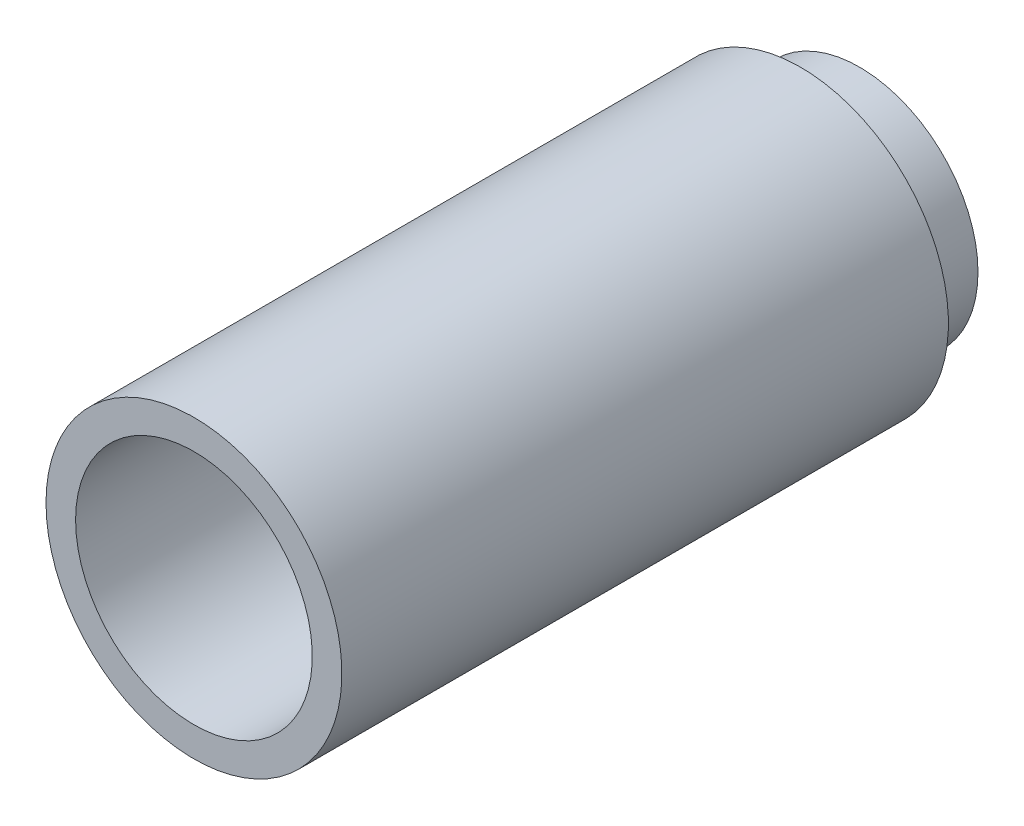
ISO-10303-21;
HEADER;
FILE_DESCRIPTION(('STEP AP214'),'2;1');
FILE_NAME('part.step','',(''),(''),'','','');
FILE_SCHEMA(('AUTOMOTIVE_DESIGN { 1 0 10303 214 1 1 1 1 }'));
ENDSEC;
DATA;
#1=APPLICATION_CONTEXT('core data for automotive mechanical design processes');
#2=APPLICATION_PROTOCOL_DEFINITION('international standard','automotive_design',2000,#1);
#3=PRODUCT_CONTEXT('',#1,'mechanical');
#4=PRODUCT('Part','Part','',(#3));
#5=PRODUCT_RELATED_PRODUCT_CATEGORY('part','',(#4));
#6=PRODUCT_DEFINITION_FORMATION('','',#4);
#7=PRODUCT_DEFINITION_CONTEXT('part definition',#1,'design');
#8=PRODUCT_DEFINITION('design','',#6,#7);
#9=PRODUCT_DEFINITION_SHAPE('','',#8);
#10=(LENGTH_UNIT() NAMED_UNIT(*) SI_UNIT(.MILLI.,.METRE.));
#11=(NAMED_UNIT(*) PLANE_ANGLE_UNIT() SI_UNIT($,.RADIAN.));
#12=(NAMED_UNIT(*) SI_UNIT($,.STERADIAN.) SOLID_ANGLE_UNIT());
#13=UNCERTAINTY_MEASURE_WITH_UNIT(LENGTH_MEASURE(1.E-05),#10,'distance_accuracy_value','');
#14=(GEOMETRIC_REPRESENTATION_CONTEXT(3) GLOBAL_UNCERTAINTY_ASSIGNED_CONTEXT((#13)) GLOBAL_UNIT_ASSIGNED_CONTEXT((#10,
#11,#12)) REPRESENTATION_CONTEXT('',''));
#15=CARTESIAN_POINT('',(0.,0.,0.));
#16=DIRECTION('',(0.,0.,1.));
#17=DIRECTION('',(1.,0.,0.));
#18=AXIS2_PLACEMENT_3D('',#15,#16,#17);
#19=CARTESIAN_POINT('',(0.,0.,225.));
#20=DIRECTION('',(0.,0.,1.));
#21=DIRECTION('',(1.,0.,0.));
#22=AXIS2_PLACEMENT_3D('',#19,#20,#21);
#23=PLANE('',#22);
#24=CARTESIAN_POINT('',(0.,0.,225.));
#25=DIRECTION('',(0.,0.,1.));
#26=DIRECTION('',(1.,0.,0.));
#27=AXIS2_PLACEMENT_3D('',#24,#25,#26);
#28=CIRCLE('',#27,50.);
#29=CARTESIAN_POINT('',(-50.,0.,225.));
#30=VERTEX_POINT('',#29);
#31=EDGE_CURVE('E11',#30,#30,#28,.T.);
#32=ORIENTED_EDGE('',*,*,#31,.T.);
#33=EDGE_LOOP('',(#32));
#34=FACE_BOUND('',#33,.T.);
#35=CARTESIAN_POINT('',(0.,0.,225.));
#36=DIRECTION('',(0.,0.,1.));
#37=DIRECTION('',(1.,0.,0.));
#38=AXIS2_PLACEMENT_3D('',#35,#36,#37);
#39=CIRCLE('',#38,40.);
#40=CARTESIAN_POINT('',(-40.,0.,225.));
#41=VERTEX_POINT('',#40);
#42=EDGE_CURVE('E50',#41,#41,#39,.T.);
#43=ORIENTED_EDGE('',*,*,#42,.F.);
#44=EDGE_LOOP('',(#43));
#45=FACE_BOUND('',#44,.T.);
#46=ADVANCED_FACE('F39',(#34,#45),#23,.T.);
#47=CARTESIAN_POINT('',(0.,0.,20.));
#48=DIRECTION('',(0.,0.,1.));
#49=DIRECTION('',(1.,0.,0.));
#50=AXIS2_PLACEMENT_3D('',#47,#48,#49);
#51=PLANE('',#50);
#52=CARTESIAN_POINT('',(0.,0.,20.));
#53=DIRECTION('',(0.,0.,1.));
#54=DIRECTION('',(1.,0.,0.));
#55=AXIS2_PLACEMENT_3D('',#52,#53,#54);
#56=CIRCLE('',#55,50.);
#57=CARTESIAN_POINT('',(-50.,0.,20.));
#58=VERTEX_POINT('',#57);
#59=EDGE_CURVE('E43',#58,#58,#56,.T.);
#60=ORIENTED_EDGE('',*,*,#59,.F.);
#61=EDGE_LOOP('',(#60));
#62=FACE_BOUND('',#61,.T.);
#63=CARTESIAN_POINT('',(0.,0.,20.));
#64=DIRECTION('',(0.,0.,1.));
#65=DIRECTION('',(1.,0.,0.));
#66=AXIS2_PLACEMENT_3D('',#63,#64,#65);
#67=CIRCLE('',#66,40.);
#68=CARTESIAN_POINT('',(-40.,0.,20.));
#69=VERTEX_POINT('',#68);
#70=EDGE_CURVE('E52',#69,#69,#67,.T.);
#71=ORIENTED_EDGE('',*,*,#70,.T.);
#72=EDGE_LOOP('',(#71));
#73=FACE_BOUND('',#72,.T.);
#74=ADVANCED_FACE('F62',(#62,#73),#51,.F.);
#75=CARTESIAN_POINT('',(0.,0.,225.));
#76=DIRECTION('',(0.,0.,-1.));
#77=DIRECTION('',(-1.,0.,0.));
#78=AXIS2_PLACEMENT_3D('',#75,#76,#77);
#79=CYLINDRICAL_SURFACE('',#78,50.);
#80=CARTESIAN_POINT('',(-50.,0.,225.));
#81=CARTESIAN_POINT('',(-50.,0.,222.864583333333));
#82=CARTESIAN_POINT('',(-50.,0.,220.729166666667));
#83=CARTESIAN_POINT('',(-50.,0.,216.458333333333));
#84=CARTESIAN_POINT('',(-50.,0.,214.322916666667));
#85=CARTESIAN_POINT('',(-50.,0.,210.052083333333));
#86=CARTESIAN_POINT('',(-50.,0.,207.916666666667));
#87=CARTESIAN_POINT('',(-50.,0.,203.645833333333));
#88=CARTESIAN_POINT('',(-50.,0.,201.510416666667));
#89=CARTESIAN_POINT('',(-50.,0.,197.239583333333));
#90=CARTESIAN_POINT('',(-50.,0.,195.104166666667));
#91=CARTESIAN_POINT('',(-50.,0.,190.833333333333));
#92=CARTESIAN_POINT('',(-50.,0.,188.697916666667));
#93=CARTESIAN_POINT('',(-50.,0.,184.427083333333));
#94=CARTESIAN_POINT('',(-50.,0.,182.291666666667));
#95=CARTESIAN_POINT('',(-50.,0.,178.020833333333));
#96=CARTESIAN_POINT('',(-50.,0.,175.885416666667));
#97=CARTESIAN_POINT('',(-50.,0.,171.614583333333));
#98=CARTESIAN_POINT('',(-50.,0.,169.479166666667));
#99=CARTESIAN_POINT('',(-50.,0.,165.208333333333));
#100=CARTESIAN_POINT('',(-50.,0.,163.072916666667));
#101=CARTESIAN_POINT('',(-50.,0.,158.802083333333));
#102=CARTESIAN_POINT('',(-50.,0.,156.666666666667));
#103=CARTESIAN_POINT('',(-50.,0.,152.395833333333));
#104=CARTESIAN_POINT('',(-50.,0.,150.260416666667));
#105=CARTESIAN_POINT('',(-50.,0.,145.989583333333));
#106=CARTESIAN_POINT('',(-50.,0.,143.854166666667));
#107=CARTESIAN_POINT('',(-50.,0.,139.583333333333));
#108=CARTESIAN_POINT('',(-50.,0.,137.447916666667));
#109=CARTESIAN_POINT('',(-50.,0.,133.177083333333));
#110=CARTESIAN_POINT('',(-50.,0.,131.041666666667));
#111=CARTESIAN_POINT('',(-50.,0.,126.770833333333));
#112=CARTESIAN_POINT('',(-50.,0.,124.635416666667));
#113=CARTESIAN_POINT('',(-50.,0.,120.364583333333));
#114=CARTESIAN_POINT('',(-50.,0.,118.229166666667));
#115=CARTESIAN_POINT('',(-50.,0.,113.958333333333));
#116=CARTESIAN_POINT('',(-50.,0.,111.822916666667));
#117=CARTESIAN_POINT('',(-50.,0.,107.552083333333));
#118=CARTESIAN_POINT('',(-50.,0.,105.416666666667));
#119=CARTESIAN_POINT('',(-50.,0.,101.145833333333));
#120=CARTESIAN_POINT('',(-50.,0.,99.0104166666667));
#121=CARTESIAN_POINT('',(-50.,0.,94.7395833333333));
#122=CARTESIAN_POINT('',(-50.,0.,92.6041666666667));
#123=CARTESIAN_POINT('',(-50.,0.,88.3333333333333));
#124=CARTESIAN_POINT('',(-50.,0.,86.1979166666667));
#125=CARTESIAN_POINT('',(-50.,0.,81.9270833333333));
#126=CARTESIAN_POINT('',(-50.,0.,79.7916666666666));
#127=CARTESIAN_POINT('',(-50.,0.,75.5208333333333));
#128=CARTESIAN_POINT('',(-50.,0.,73.3854166666666));
#129=CARTESIAN_POINT('',(-50.,0.,69.1145833333333));
#130=CARTESIAN_POINT('',(-50.,0.,66.9791666666666));
#131=CARTESIAN_POINT('',(-50.,0.,62.7083333333333));
#132=CARTESIAN_POINT('',(-50.,0.,60.5729166666666));
#133=CARTESIAN_POINT('',(-50.,0.,56.3020833333333));
#134=CARTESIAN_POINT('',(-50.,0.,54.1666666666667));
#135=CARTESIAN_POINT('',(-50.,0.,49.8958333333333));
#136=CARTESIAN_POINT('',(-50.,0.,47.7604166666667));
#137=CARTESIAN_POINT('',(-50.,0.,43.4895833333333));
#138=CARTESIAN_POINT('',(-50.,0.,41.3541666666667));
#139=CARTESIAN_POINT('',(-50.,0.,37.0833333333333));
#140=CARTESIAN_POINT('',(-50.,0.,34.9479166666667));
#141=CARTESIAN_POINT('',(-50.,0.,30.6770833333333));
#142=CARTESIAN_POINT('',(-50.,0.,28.5416666666667));
#143=CARTESIAN_POINT('',(-50.,0.,24.2708333333333));
#144=CARTESIAN_POINT('',(-50.,0.,22.1354166666667));
#145=CARTESIAN_POINT('',(-50.,0.,20.));
#146=B_SPLINE_CURVE_WITH_KNOTS('',3,(#80,#81,#82,#83,#84,#85,#86,#87,#88,#89,#90,#91,#92,#93,
#94,#95,#96,#97,#98,#99,#100,#101,#102,#103,#104,#105,#106,#107,#108,#109,#110,#111,#112,#113,
#114,#115,#116,#117,#118,#119,#120,#121,#122,#123,#124,#125,#126,#127,#128,#129,#130,#131,#132,
#133,#134,#135,#136,#137,#138,#139,#140,#141,#142,#143,#144,#145),.UNSPECIFIED.,.F.,.F.,(4,2,2,
2,2,2,2,2,2,2,2,2,2,2,2,2,2,2,2,2,2,2,2,2,2,2,2,2,2,2,2,2,4),(0.,6.40624999999997,12.8125,
19.21875,25.625,32.03125,38.4375,44.84375,51.25,57.65625,64.0625,70.46875,76.875,83.28125,
89.6874999999999,96.0937499999999,102.5,108.90625,115.3125,121.71875,128.125,134.53125,140.9375,
147.34375,153.75,160.15625,166.5625,172.96875,179.375,185.78125,192.1875,198.59375,205.),.UNSPECIFIED.);
#147=EDGE_CURVE('BSEAM41',#30,#58,#146,.T.);
#148=ORIENTED_EDGE('',*,*,#31,.F.);
#149=ORIENTED_EDGE('',*,*,#59,.T.);
#150=ORIENTED_EDGE('',*,*,#147,.T.);
#151=ORIENTED_EDGE('',*,*,#147,.F.);
#152=EDGE_LOOP('',(#148,#150,#149,#151));
#153=FACE_BOUND('',#152,.T.);
#154=ADVANCED_FACE('F41',(#153),#79,.T.);
#155=CARTESIAN_POINT('',(0.,0.,225.));
#156=DIRECTION('',(0.,0.,-1.));
#157=DIRECTION('',(-1.,0.,0.));
#158=AXIS2_PLACEMENT_3D('',#155,#156,#157);
#159=CYLINDRICAL_SURFACE('',#158,40.);
#160=CARTESIAN_POINT('',(-40.,0.,225.));
#161=CARTESIAN_POINT('',(-40.,0.,222.864583333333));
#162=CARTESIAN_POINT('',(-40.,0.,220.729166666667));
#163=CARTESIAN_POINT('',(-40.,0.,216.458333333333));
#164=CARTESIAN_POINT('',(-40.,0.,214.322916666667));
#165=CARTESIAN_POINT('',(-40.,0.,210.052083333333));
#166=CARTESIAN_POINT('',(-40.,0.,207.916666666667));
#167=CARTESIAN_POINT('',(-40.,0.,203.645833333333));
#168=CARTESIAN_POINT('',(-40.,0.,201.510416666667));
#169=CARTESIAN_POINT('',(-40.,0.,197.239583333333));
#170=CARTESIAN_POINT('',(-40.,0.,195.104166666667));
#171=CARTESIAN_POINT('',(-40.,0.,190.833333333333));
#172=CARTESIAN_POINT('',(-40.,0.,188.697916666667));
#173=CARTESIAN_POINT('',(-40.,0.,184.427083333333));
#174=CARTESIAN_POINT('',(-40.,0.,182.291666666667));
#175=CARTESIAN_POINT('',(-40.,0.,178.020833333333));
#176=CARTESIAN_POINT('',(-40.,0.,175.885416666667));
#177=CARTESIAN_POINT('',(-40.,0.,171.614583333333));
#178=CARTESIAN_POINT('',(-40.,0.,169.479166666667));
#179=CARTESIAN_POINT('',(-40.,0.,165.208333333333));
#180=CARTESIAN_POINT('',(-40.,0.,163.072916666667));
#181=CARTESIAN_POINT('',(-40.,0.,158.802083333333));
#182=CARTESIAN_POINT('',(-40.,0.,156.666666666667));
#183=CARTESIAN_POINT('',(-40.,0.,152.395833333333));
#184=CARTESIAN_POINT('',(-40.,0.,150.260416666667));
#185=CARTESIAN_POINT('',(-40.,0.,145.989583333333));
#186=CARTESIAN_POINT('',(-40.,0.,143.854166666667));
#187=CARTESIAN_POINT('',(-40.,0.,139.583333333333));
#188=CARTESIAN_POINT('',(-40.,0.,137.447916666667));
#189=CARTESIAN_POINT('',(-40.,0.,133.177083333333));
#190=CARTESIAN_POINT('',(-40.,0.,131.041666666667));
#191=CARTESIAN_POINT('',(-40.,0.,126.770833333333));
#192=CARTESIAN_POINT('',(-40.,0.,124.635416666667));
#193=CARTESIAN_POINT('',(-40.,0.,120.364583333333));
#194=CARTESIAN_POINT('',(-40.,0.,118.229166666667));
#195=CARTESIAN_POINT('',(-40.,0.,113.958333333333));
#196=CARTESIAN_POINT('',(-40.,0.,111.822916666667));
#197=CARTESIAN_POINT('',(-40.,0.,107.552083333333));
#198=CARTESIAN_POINT('',(-40.,0.,105.416666666667));
#199=CARTESIAN_POINT('',(-40.,0.,101.145833333333));
#200=CARTESIAN_POINT('',(-40.,0.,99.0104166666666));
#201=CARTESIAN_POINT('',(-40.,0.,94.7395833333333));
#202=CARTESIAN_POINT('',(-40.,0.,92.6041666666667));
#203=CARTESIAN_POINT('',(-40.,0.,88.3333333333333));
#204=CARTESIAN_POINT('',(-40.,0.,86.1979166666667));
#205=CARTESIAN_POINT('',(-40.,0.,81.9270833333333));
#206=CARTESIAN_POINT('',(-40.,0.,79.7916666666666));
#207=CARTESIAN_POINT('',(-40.,0.,75.5208333333333));
#208=CARTESIAN_POINT('',(-40.,0.,73.3854166666667));
#209=CARTESIAN_POINT('',(-40.,0.,69.1145833333333));
#210=CARTESIAN_POINT('',(-40.,0.,66.9791666666667));
#211=CARTESIAN_POINT('',(-40.,0.,62.7083333333333));
#212=CARTESIAN_POINT('',(-40.,0.,60.5729166666667));
#213=CARTESIAN_POINT('',(-40.,0.,56.3020833333333));
#214=CARTESIAN_POINT('',(-40.,0.,54.1666666666667));
#215=CARTESIAN_POINT('',(-40.,0.,49.8958333333333));
#216=CARTESIAN_POINT('',(-40.,0.,47.7604166666667));
#217=CARTESIAN_POINT('',(-40.,0.,43.4895833333333));
#218=CARTESIAN_POINT('',(-40.,0.,41.3541666666667));
#219=CARTESIAN_POINT('',(-40.,0.,37.0833333333333));
#220=CARTESIAN_POINT('',(-40.,0.,34.9479166666667));
#221=CARTESIAN_POINT('',(-40.,0.,30.6770833333333));
#222=CARTESIAN_POINT('',(-40.,0.,28.5416666666667));
#223=CARTESIAN_POINT('',(-40.,0.,24.2708333333333));
#224=CARTESIAN_POINT('',(-40.,0.,22.1354166666667));
#225=CARTESIAN_POINT('',(-40.,0.,20.));
#226=B_SPLINE_CURVE_WITH_KNOTS('',3,(#160,#161,#162,#163,#164,#165,#166,#167,#168,#169,#170,
#171,#172,#173,#174,#175,#176,#177,#178,#179,#180,#181,#182,#183,#184,#185,#186,#187,#188,#189,
#190,#191,#192,#193,#194,#195,#196,#197,#198,#199,#200,#201,#202,#203,#204,#205,#206,#207,#208,
#209,#210,#211,#212,#213,#214,#215,#216,#217,#218,#219,#220,#221,#222,#223,#224,#225),
.UNSPECIFIED.,.F.,.F.,(4,2,2,2,2,2,2,2,2,2,2,2,2,2,2,2,2,2,2,2,2,2,2,2,2,2,2,2,2,2,2,2,4),(0.,
6.40625,12.8125,19.21875,25.625,32.03125,38.4375,44.84375,51.25,57.65625,64.0625,70.46875,
76.875,83.28125,89.6875,96.09375,102.5,108.90625,115.3125,121.71875,128.125,134.53125,140.9375,
147.34375,153.75,160.15625,166.5625,172.96875,179.375,185.78125,192.1875,198.59375,205.),.UNSPECIFIED.);
#227=EDGE_CURVE('BSEAM58',#41,#69,#226,.T.);
#228=ORIENTED_EDGE('',*,*,#42,.T.);
#229=ORIENTED_EDGE('',*,*,#70,.F.);
#230=ORIENTED_EDGE('',*,*,#227,.T.);
#231=ORIENTED_EDGE('',*,*,#227,.F.);
#232=EDGE_LOOP('',(#228,#230,#229,#231));
#233=FACE_BOUND('',#232,.T.);
#234=ADVANCED_FACE('F58',(#233),#159,.F.);
#235=CLOSED_SHELL('',(#46,#74,#154,#234));
#236=MANIFOLD_SOLID_BREP('B2',#235);
#237=CARTESIAN_POINT('',(0.,0.,20.));
#238=DIRECTION('',(0.,0.,1.));
#239=DIRECTION('',(1.,0.,0.));
#240=AXIS2_PLACEMENT_3D('',#237,#238,#239);
#241=PLANE('',#240);
#242=CARTESIAN_POINT('',(0.,0.,20.));
#243=DIRECTION('',(0.,0.,1.));
#244=DIRECTION('',(1.,0.,0.));
#245=AXIS2_PLACEMENT_3D('',#242,#243,#244);
#246=CIRCLE('',#245,40.);
#247=CARTESIAN_POINT('',(40.,0.,20.));
#248=VERTEX_POINT('',#247);
#249=EDGE_CURVE('E38',#248,#248,#246,.T.);
#250=ORIENTED_EDGE('',*,*,#249,.T.);
#251=EDGE_LOOP('',(#250));
#252=FACE_BOUND('',#251,.T.);
#253=CARTESIAN_POINT('',(0.,0.,20.));
#254=DIRECTION('',(0.,0.,1.));
#255=DIRECTION('',(1.,0.,0.));
#256=AXIS2_PLACEMENT_3D('',#253,#254,#255);
#257=CIRCLE('',#256,35.);
#258=CARTESIAN_POINT('',(35.,0.,20.));
#259=VERTEX_POINT('',#258);
#260=EDGE_CURVE('E112',#259,#259,#257,.T.);
#261=ORIENTED_EDGE('',*,*,#260,.F.);
#262=EDGE_LOOP('',(#261));
#263=FACE_BOUND('',#262,.T.);
#264=ADVANCED_FACE('F101',(#252,#263),#241,.T.);
#265=CARTESIAN_POINT('',(0.,0.,0.));
#266=DIRECTION('',(0.,0.,1.));
#267=DIRECTION('',(1.,0.,0.));
#268=AXIS2_PLACEMENT_3D('',#265,#266,#267);
#269=PLANE('',#268);
#270=CARTESIAN_POINT('',(0.,0.,0.));
#271=DIRECTION('',(0.,0.,1.));
#272=DIRECTION('',(1.,0.,0.));
#273=AXIS2_PLACEMENT_3D('',#270,#271,#272);
#274=CIRCLE('',#273,40.);
#275=CARTESIAN_POINT('',(40.,0.,0.));
#276=VERTEX_POINT('',#275);
#277=EDGE_CURVE('E105',#276,#276,#274,.T.);
#278=ORIENTED_EDGE('',*,*,#277,.F.);
#279=EDGE_LOOP('',(#278));
#280=FACE_BOUND('',#279,.T.);
#281=CARTESIAN_POINT('',(0.,0.,0.));
#282=DIRECTION('',(0.,0.,1.));
#283=DIRECTION('',(1.,0.,0.));
#284=AXIS2_PLACEMENT_3D('',#281,#282,#283);
#285=CIRCLE('',#284,35.);
#286=CARTESIAN_POINT('',(35.,0.,0.));
#287=VERTEX_POINT('',#286);
#288=EDGE_CURVE('E114',#287,#287,#285,.T.);
#289=ORIENTED_EDGE('',*,*,#288,.T.);
#290=EDGE_LOOP('',(#289));
#291=FACE_BOUND('',#290,.T.);
#292=ADVANCED_FACE('F124',(#280,#291),#269,.F.);
#293=CARTESIAN_POINT('',(0.,0.,20.));
#294=DIRECTION('',(0.,0.,-1.));
#295=DIRECTION('',(-1.,0.,0.));
#296=AXIS2_PLACEMENT_3D('',#293,#294,#295);
#297=CYLINDRICAL_SURFACE('',#296,40.);
#298=ORIENTED_EDGE('',*,*,#249,.F.);
#299=EDGE_LOOP('',(#298));
#300=FACE_BOUND('',#299,.T.);
#301=ORIENTED_EDGE('',*,*,#277,.T.);
#302=EDGE_LOOP('',(#301));
#303=FACE_BOUND('',#302,.T.);
#304=ADVANCED_FACE('F103',(#300,#303),#297,.T.);
#305=CARTESIAN_POINT('',(0.,0.,20.));
#306=DIRECTION('',(0.,0.,-1.));
#307=DIRECTION('',(-1.,0.,0.));
#308=AXIS2_PLACEMENT_3D('',#305,#306,#307);
#309=CYLINDRICAL_SURFACE('',#308,35.);
#310=ORIENTED_EDGE('',*,*,#260,.T.);
#311=EDGE_LOOP('',(#310));
#312=FACE_BOUND('',#311,.T.);
#313=ORIENTED_EDGE('',*,*,#288,.F.);
#314=EDGE_LOOP('',(#313));
#315=FACE_BOUND('',#314,.T.);
#316=ADVANCED_FACE('F120',(#312,#315),#309,.F.);
#317=CLOSED_SHELL('',(#264,#292,#304,#316));
#318=MANIFOLD_SOLID_BREP('B6',#317);
#319=ADVANCED_BREP_SHAPE_REPRESENTATION('',(#18,#236,#318),#14);
#320=SHAPE_DEFINITION_REPRESENTATION(#9,#319);
ENDSEC;
END-ISO-10303-21;
